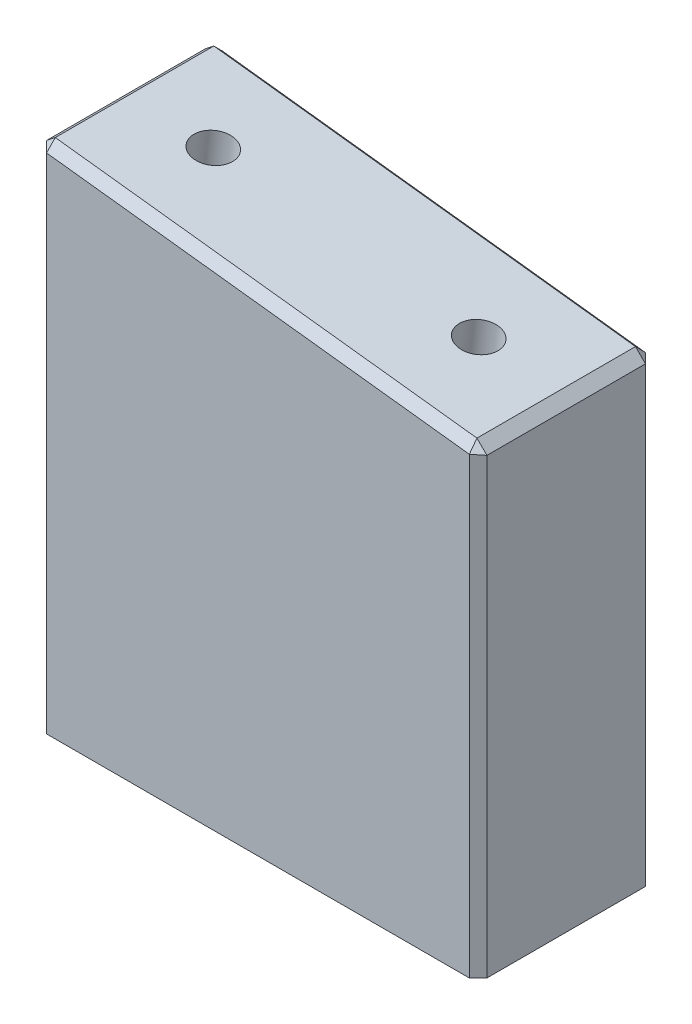
ISO-10303-21;
HEADER;
FILE_DESCRIPTION(('STEP AP214'),'2;1');
FILE_NAME('part.step','',(''),(''),'','','');
FILE_SCHEMA(('AUTOMOTIVE_DESIGN { 1 0 10303 214 1 1 1 1 }'));
ENDSEC;
DATA;
#1=APPLICATION_CONTEXT('core data for automotive mechanical design processes');
#2=APPLICATION_PROTOCOL_DEFINITION('international standard','automotive_design',2000,#1);
#3=PRODUCT_CONTEXT('',#1,'mechanical');
#4=PRODUCT('Part','Part','',(#3));
#5=PRODUCT_RELATED_PRODUCT_CATEGORY('part','',(#4));
#6=PRODUCT_DEFINITION_FORMATION('','',#4);
#7=PRODUCT_DEFINITION_CONTEXT('part definition',#1,'design');
#8=PRODUCT_DEFINITION('design','',#6,#7);
#9=PRODUCT_DEFINITION_SHAPE('','',#8);
#10=(LENGTH_UNIT() NAMED_UNIT(*) SI_UNIT(.MILLI.,.METRE.));
#11=(NAMED_UNIT(*) PLANE_ANGLE_UNIT() SI_UNIT($,.RADIAN.));
#12=(NAMED_UNIT(*) SI_UNIT($,.STERADIAN.) SOLID_ANGLE_UNIT());
#13=UNCERTAINTY_MEASURE_WITH_UNIT(LENGTH_MEASURE(1.E-05),#10,'distance_accuracy_value','');
#14=(GEOMETRIC_REPRESENTATION_CONTEXT(3) GLOBAL_UNCERTAINTY_ASSIGNED_CONTEXT((#13)) GLOBAL_UNIT_ASSIGNED_CONTEXT((#10,
#11,#12)) REPRESENTATION_CONTEXT('',''));
#15=CARTESIAN_POINT('',(0.,0.,0.));
#16=DIRECTION('',(0.,0.,1.));
#17=DIRECTION('',(1.,0.,0.));
#18=AXIS2_PLACEMENT_3D('',#15,#16,#17);
#19=CARTESIAN_POINT('',(2.10869816012002,41.8949020387802,3.));
#20=DIRECTION('',(-0.993190231504627,0.116503922868656,0.));
#21=DIRECTION('',(-0.116503922868656,-0.993190231504627,0.));
#22=AXIS2_PLACEMENT_3D('',#19,#20,#21);
#23=PLANE('',#22);
#24=DIRECTION('',(0.,0.,1.));
#25=VECTOR('',#24,1.);
#26=CARTESIAN_POINT('',(3.27373738880657,51.8268043538265,3.));
#27=LINE('',#26,#25);
#28=CARTESIAN_POINT('',(3.27373738880657,51.8268043538265,3.));
#29=VERTEX_POINT('',#28);
#30=CARTESIAN_POINT('',(3.27373738880658,51.8268043538265,17.));
#31=VERTEX_POINT('',#30);
#32=EDGE_CURVE('E186',#29,#31,#27,.T.);
#33=ORIENTED_EDGE('',*,*,#32,.T.);
#34=DIRECTION('',(0.116503922868656,0.993190231504627,0.));
#35=VECTOR('',#34,1.);
#36=CARTESIAN_POINT('',(2.10869816012002,41.8949020387802,17.));
#37=LINE('',#36,#35);
#38=CARTESIAN_POINT('',(2.10869816012002,41.8949020387802,17.));
#39=VERTEX_POINT('',#38);
#40=EDGE_CURVE('E163',#39,#31,#37,.T.);
#41=ORIENTED_EDGE('',*,*,#40,.F.);
#42=DIRECTION('',(0.,0.,1.));
#43=VECTOR('',#42,1.);
#44=CARTESIAN_POINT('',(2.10869816012002,41.8949020387802,3.));
#45=LINE('',#44,#43);
#46=CARTESIAN_POINT('',(2.10869816012002,41.8949020387802,3.));
#47=VERTEX_POINT('',#46);
#48=EDGE_CURVE('E174',#47,#39,#45,.T.);
#49=ORIENTED_EDGE('',*,*,#48,.F.);
#50=DIRECTION('',(0.116503922868656,0.993190231504627,0.));
#51=VECTOR('',#50,1.);
#52=CARTESIAN_POINT('',(2.10869816012002,41.8949020387802,3.));
#53=LINE('',#52,#51);
#54=EDGE_CURVE('E207',#47,#29,#53,.T.);
#55=ORIENTED_EDGE('',*,*,#54,.T.);
#56=EDGE_LOOP('',(#33,#41,#49,#55));
#57=FACE_BOUND('',#56,.T.);
#58=ADVANCED_FACE('F45',(#57),#23,.F.);
#59=CARTESIAN_POINT('',(2.10869816012002,41.8949020387802,3.));
#60=DIRECTION('',(0.,0.,-1.));
#61=DIRECTION('',(-1.,0.,0.));
#62=AXIS2_PLACEMENT_3D('',#59,#60,#61);
#63=PLANE('',#62);
#64=DIRECTION('',(-0.993190231504627,0.116503922868656,0.));
#65=VECTOR('',#64,1.);
#66=CARTESIAN_POINT('',(3.27373738880657,51.8268043538265,3.));
#67=LINE('',#66,#65);
#68=CARTESIAN_POINT('',(45.3282155367696,46.8936993725085,3.));
#69=VERTEX_POINT('',#68);
#70=EDGE_CURVE('E182',#69,#29,#67,.T.);
#71=ORIENTED_EDGE('',*,*,#70,.T.);
#72=ORIENTED_EDGE('',*,*,#54,.F.);
#73=DIRECTION('',(0.,-1.,0.));
#74=VECTOR('',#73,1.);
#75=CARTESIAN_POINT('',(2.10869816012002,41.8949020387802,3.));
#76=LINE('',#75,#74);
#77=CARTESIAN_POINT('',(2.10869816012002,0.,3.));
#78=VERTEX_POINT('',#77);
#79=EDGE_CURVE('E177',#47,#78,#76,.T.);
#80=ORIENTED_EDGE('',*,*,#79,.T.);
#81=DIRECTION('',(1.,0.,0.));
#82=VECTOR('',#81,1.);
#83=CARTESIAN_POINT('',(2.10869816012002,0.,3.));
#84=LINE('',#83,#82);
#85=CARTESIAN_POINT('',(44.163176308083,0.,3.));
#86=VERTEX_POINT('',#85);
#87=EDGE_CURVE('E341',#78,#86,#84,.T.);
#88=ORIENTED_EDGE('',*,*,#87,.T.);
#89=DIRECTION('',(0.,1.,0.));
#90=VECTOR('',#89,1.);
#91=CARTESIAN_POINT('',(44.163176308083,0.,3.));
#92=LINE('',#91,#90);
#93=CARTESIAN_POINT('',(44.163176308083,36.9617970574622,3.));
#94=VERTEX_POINT('',#93);
#95=EDGE_CURVE('E171',#86,#94,#92,.T.);
#96=ORIENTED_EDGE('',*,*,#95,.T.);
#97=DIRECTION('',(0.116503922868656,0.993190231504627,0.));
#98=VECTOR('',#97,1.);
#99=CARTESIAN_POINT('',(44.163176308083,36.9617970574622,3.));
#100=LINE('',#99,#98);
#101=EDGE_CURVE('E193',#94,#69,#100,.T.);
#102=ORIENTED_EDGE('',*,*,#101,.T.);
#103=EDGE_LOOP('',(#71,#72,#80,#88,#96,#102));
#104=FACE_BOUND('',#103,.T.);
#105=ADVANCED_FACE('F367',(#104),#63,.F.);
#106=CARTESIAN_POINT('',(44.163176308083,36.9617970574622,3.));
#107=DIRECTION('',(0.993190231504627,-0.116503922868656,0.));
#108=DIRECTION('',(0.116503922868656,0.993190231504627,0.));
#109=AXIS2_PLACEMENT_3D('',#106,#107,#108);
#110=PLANE('',#109);
#111=DIRECTION('',(0.,0.,-1.));
#112=VECTOR('',#111,1.);
#113=CARTESIAN_POINT('',(45.3282155367696,46.8936993725085,3.));
#114=LINE('',#113,#112);
#115=CARTESIAN_POINT('',(45.3282155367696,46.8936993725085,17.));
#116=VERTEX_POINT('',#115);
#117=EDGE_CURVE('E356',#116,#69,#114,.T.);
#118=ORIENTED_EDGE('',*,*,#117,.T.);
#119=ORIENTED_EDGE('',*,*,#101,.F.);
#120=DIRECTION('',(0.,0.,-1.));
#121=VECTOR('',#120,1.);
#122=CARTESIAN_POINT('',(44.163176308083,36.9617970574622,3.));
#123=LINE('',#122,#121);
#124=CARTESIAN_POINT('',(44.163176308083,36.9617970574622,17.));
#125=VERTEX_POINT('',#124);
#126=EDGE_CURVE('E181',#125,#94,#123,.T.);
#127=ORIENTED_EDGE('',*,*,#126,.F.);
#128=DIRECTION('',(0.116503922868656,0.993190231504627,0.));
#129=VECTOR('',#128,1.);
#130=CARTESIAN_POINT('',(44.163176308083,36.9617970574622,17.));
#131=LINE('',#130,#129);
#132=EDGE_CURVE('E188',#125,#116,#131,.T.);
#133=ORIENTED_EDGE('',*,*,#132,.T.);
#134=EDGE_LOOP('',(#118,#119,#127,#133));
#135=FACE_BOUND('',#134,.T.);
#136=ADVANCED_FACE('F373',(#135),#110,.F.);
#137=CARTESIAN_POINT('',(2.10869816012002,41.8949020387802,17.));
#138=DIRECTION('',(0.,0.,1.));
#139=DIRECTION('',(1.,0.,0.));
#140=AXIS2_PLACEMENT_3D('',#137,#138,#139);
#141=PLANE('',#140);
#142=DIRECTION('',(0.993190231504627,-0.116503922868656,0.));
#143=VECTOR('',#142,1.);
#144=CARTESIAN_POINT('',(3.27373738880658,51.8268043538265,17.));
#145=LINE('',#144,#143);
#146=EDGE_CURVE('E353',#31,#116,#145,.T.);
#147=ORIENTED_EDGE('',*,*,#146,.T.);
#148=ORIENTED_EDGE('',*,*,#132,.F.);
#149=DIRECTION('',(0.,1.,0.));
#150=VECTOR('',#149,1.);
#151=CARTESIAN_POINT('',(44.163176308083,0.,17.));
#152=LINE('',#151,#150);
#153=CARTESIAN_POINT('',(44.163176308083,0.,17.));
#154=VERTEX_POINT('',#153);
#155=EDGE_CURVE('E335',#154,#125,#152,.T.);
#156=ORIENTED_EDGE('',*,*,#155,.F.);
#157=DIRECTION('',(1.,0.,0.));
#158=VECTOR('',#157,1.);
#159=CARTESIAN_POINT('',(2.10869816012002,0.,17.));
#160=LINE('',#159,#158);
#161=CARTESIAN_POINT('',(2.10869816012002,0.,17.));
#162=VERTEX_POINT('',#161);
#163=EDGE_CURVE('E167',#162,#154,#160,.T.);
#164=ORIENTED_EDGE('',*,*,#163,.F.);
#165=DIRECTION('',(0.,-1.,0.));
#166=VECTOR('',#165,1.);
#167=CARTESIAN_POINT('',(2.10869816012002,41.8949020387802,17.));
#168=LINE('',#167,#166);
#169=EDGE_CURVE('E158',#39,#162,#168,.T.);
#170=ORIENTED_EDGE('',*,*,#169,.F.);
#171=ORIENTED_EDGE('',*,*,#40,.T.);
#172=EDGE_LOOP('',(#147,#148,#156,#164,#170,#171));
#173=FACE_BOUND('',#172,.T.);
#174=ADVANCED_FACE('F161',(#173),#141,.F.);
#175=CARTESIAN_POINT('',(6.04134343223708,51.5021566168807,0.));
#176=DIRECTION('',(0.116503922868656,0.993190231504627,0.));
#177=DIRECTION('',(-0.993190231504627,0.116503922868656,0.));
#178=AXIS2_PLACEMENT_3D('',#175,#176,#177);
#179=PLANE('',#178);
#180=CARTESIAN_POINT('',(9.23287877783434,51.1277808166146,10.));
#181=DIRECTION('',(0.116503922868656,0.993190231504627,0.));
#182=DIRECTION('',(-0.993190231504627,0.116503922868656,0.));
#183=AXIS2_PLACEMENT_3D('',#180,#181,#182);
#184=CIRCLE('',#183,2.2);
#185=CARTESIAN_POINT('',(7.04786026852416,51.3840894469256,10.));
#186=VERTEX_POINT('',#185);
#187=EDGE_CURVE('E330',#186,#186,#184,.F.);
#188=ORIENTED_EDGE('',*,*,#187,.F.);
#189=EDGE_LOOP('',(#188));
#190=FACE_BOUND('',#189,.T.);
#191=CARTESIAN_POINT('',(39.3690741477418,47.5927229097204,10.));
#192=DIRECTION('',(0.116503922868656,0.993190231504627,0.));
#193=DIRECTION('',(-0.993190231504627,0.116503922868656,0.));
#194=AXIS2_PLACEMENT_3D('',#191,#192,#193);
#195=CIRCLE('',#194,2.20000000000001);
#196=CARTESIAN_POINT('',(37.1840556384316,47.8490315400315,10.));
#197=VERTEX_POINT('',#196);
#198=EDGE_CURVE('E316',#197,#197,#195,.F.);
#199=ORIENTED_EDGE('',*,*,#198,.F.);
#200=EDGE_LOOP('',(#199));
#201=FACE_BOUND('',#200,.T.);
#202=ORIENTED_EDGE('',*,*,#32,.F.);
#203=ORIENTED_EDGE('',*,*,#70,.F.);
#204=ORIENTED_EDGE('',*,*,#117,.F.);
#205=ORIENTED_EDGE('',*,*,#146,.F.);
#206=EDGE_LOOP('',(#202,#203,#204,#205));
#207=FACE_BOUND('',#206,.T.);
#208=ADVANCED_FACE('F376',(#190,#201,#207),#179,.F.);
#209=CARTESIAN_POINT('',(2.10869816012002,41.8949020387802,17.));
#210=DIRECTION('',(1.,0.,0.));
#211=DIRECTION('',(0.,0.,-1.));
#212=AXIS2_PLACEMENT_3D('',#209,#210,#211);
#213=PLANE('',#212);
#214=ORIENTED_EDGE('',*,*,#79,.F.);
#215=ORIENTED_EDGE('',*,*,#48,.T.);
#216=ORIENTED_EDGE('',*,*,#169,.T.);
#217=DIRECTION('',(0.,0.,-1.));
#218=VECTOR('',#217,1.);
#219=CARTESIAN_POINT('',(2.10869816012002,0.,17.));
#220=LINE('',#219,#218);
#221=EDGE_CURVE('E349',#162,#78,#220,.T.);
#222=ORIENTED_EDGE('',*,*,#221,.T.);
#223=EDGE_LOOP('',(#214,#215,#216,#222));
#224=FACE_BOUND('',#223,.T.);
#225=ADVANCED_FACE('F175',(#224),#213,.T.);
#226=CARTESIAN_POINT('',(44.163176308083,0.,17.));
#227=DIRECTION('',(-1.,0.,0.));
#228=DIRECTION('',(0.,0.,1.));
#229=AXIS2_PLACEMENT_3D('',#226,#227,#228);
#230=PLANE('',#229);
#231=ORIENTED_EDGE('',*,*,#95,.F.);
#232=DIRECTION('',(0.,0.,-1.));
#233=VECTOR('',#232,1.);
#234=CARTESIAN_POINT('',(44.163176308083,0.,17.));
#235=LINE('',#234,#233);
#236=EDGE_CURVE('E338',#154,#86,#235,.T.);
#237=ORIENTED_EDGE('',*,*,#236,.F.);
#238=ORIENTED_EDGE('',*,*,#155,.T.);
#239=ORIENTED_EDGE('',*,*,#126,.T.);
#240=EDGE_LOOP('',(#231,#237,#238,#239));
#241=FACE_BOUND('',#240,.T.);
#242=ADVANCED_FACE('F378',(#241),#230,.T.);
#243=CARTESIAN_POINT('',(0.,0.,20.));
#244=DIRECTION('',(0.,1.,0.));
#245=DIRECTION('',(0.,0.,1.));
#246=AXIS2_PLACEMENT_3D('',#243,#244,#245);
#247=PLANE('',#246);
#248=ORIENTED_EDGE('',*,*,#221,.F.);
#249=ORIENTED_EDGE('',*,*,#163,.T.);
#250=ORIENTED_EDGE('',*,*,#236,.T.);
#251=ORIENTED_EDGE('',*,*,#87,.F.);
#252=EDGE_LOOP('',(#248,#249,#250,#251));
#253=FACE_BOUND('',#252,.T.);
#254=DIRECTION('',(1.,0.,0.));
#255=VECTOR('',#254,1.);
#256=CARTESIAN_POINT('',(0.,0.,0.));
#257=LINE('',#256,#255);
#258=CARTESIAN_POINT('',(1.00000000000001,0.,0.));
#259=VERTEX_POINT('',#258);
#260=CARTESIAN_POINT('',(49.,0.,0.));
#261=VERTEX_POINT('',#260);
#262=EDGE_CURVE('E203',#259,#261,#257,.T.);
#263=ORIENTED_EDGE('',*,*,#262,.T.);
#264=DIRECTION('',(-0.707106781186548,0.,-0.707106781186548));
#265=VECTOR('',#264,1.);
#266=CARTESIAN_POINT('',(50.,0.,1.00000000000001));
#267=LINE('',#266,#265);
#268=CARTESIAN_POINT('',(50.,0.,1.00000000000001));
#269=VERTEX_POINT('',#268);
#270=EDGE_CURVE('E256',#261,#269,#267,.F.);
#271=ORIENTED_EDGE('',*,*,#270,.T.);
#272=DIRECTION('',(0.,0.,-1.));
#273=VECTOR('',#272,1.);
#274=CARTESIAN_POINT('',(50.,0.,20.));
#275=LINE('',#274,#273);
#276=CARTESIAN_POINT('',(50.,0.,19.));
#277=VERTEX_POINT('',#276);
#278=EDGE_CURVE('E211',#277,#269,#275,.T.);
#279=ORIENTED_EDGE('',*,*,#278,.F.);
#280=DIRECTION('',(-0.707106781186548,0.,0.707106781186548));
#281=VECTOR('',#280,1.);
#282=CARTESIAN_POINT('',(49.,0.,20.));
#283=LINE('',#282,#281);
#284=CARTESIAN_POINT('',(49.,0.,20.));
#285=VERTEX_POINT('',#284);
#286=EDGE_CURVE('E247',#277,#285,#283,.T.);
#287=ORIENTED_EDGE('',*,*,#286,.T.);
#288=DIRECTION('',(1.,0.,0.));
#289=VECTOR('',#288,1.);
#290=CARTESIAN_POINT('',(0.,0.,20.));
#291=LINE('',#290,#289);
#292=CARTESIAN_POINT('',(1.00000000000001,0.,20.));
#293=VERTEX_POINT('',#292);
#294=EDGE_CURVE('E199',#293,#285,#291,.T.);
#295=ORIENTED_EDGE('',*,*,#294,.F.);
#296=DIRECTION('',(-0.707106781186547,0.,-0.707106781186548));
#297=VECTOR('',#296,1.);
#298=CARTESIAN_POINT('',(1.00000000000001,0.,20.));
#299=LINE('',#298,#297);
#300=CARTESIAN_POINT('',(0.,0.,19.));
#301=VERTEX_POINT('',#300);
#302=EDGE_CURVE('E250',#293,#301,#299,.T.);
#303=ORIENTED_EDGE('',*,*,#302,.T.);
#304=DIRECTION('',(0.,0.,-1.));
#305=VECTOR('',#304,1.);
#306=CARTESIAN_POINT('',(0.,0.,20.));
#307=LINE('',#306,#305);
#308=CARTESIAN_POINT('',(0.,0.,1.00000000000001));
#309=VERTEX_POINT('',#308);
#310=EDGE_CURVE('E202',#301,#309,#307,.T.);
#311=ORIENTED_EDGE('',*,*,#310,.T.);
#312=DIRECTION('',(-0.707106781186547,0.,0.707106781186548));
#313=VECTOR('',#312,1.);
#314=CARTESIAN_POINT('',(0.,0.,1.00000000000001));
#315=LINE('',#314,#313);
#316=EDGE_CURVE('E253',#309,#259,#315,.F.);
#317=ORIENTED_EDGE('',*,*,#316,.T.);
#318=EDGE_LOOP('',(#263,#271,#279,#287,#295,#303,#311,#317));
#319=FACE_BOUND('',#318,.T.);
#320=ADVANCED_FACE('F381',(#253,#319),#247,.F.);
#321=CARTESIAN_POINT('',(50.,0.,20.));
#322=DIRECTION('',(-1.,0.,0.));
#323=DIRECTION('',(0.,0.,1.));
#324=AXIS2_PLACEMENT_3D('',#321,#322,#323);
#325=PLANE('',#324);
#326=ORIENTED_EDGE('',*,*,#278,.T.);
#327=DIRECTION('',(0.,1.,0.));
#328=VECTOR('',#327,1.);
#329=CARTESIAN_POINT('',(50.,0.,1.00000000000001));
#330=LINE('',#329,#328);
#331=CARTESIAN_POINT('',(50.,51.3868250700616,1.00000000000001));
#332=VERTEX_POINT('',#331);
#333=EDGE_CURVE('E235',#269,#332,#330,.T.);
#334=ORIENTED_EDGE('',*,*,#333,.T.);
#335=DIRECTION('',(0.,0.,1.));
#336=VECTOR('',#335,1.);
#337=CARTESIAN_POINT('',(50.,51.3868250700616,20.));
#338=LINE('',#337,#336);
#339=CARTESIAN_POINT('',(50.,51.3868250700616,19.));
#340=VERTEX_POINT('',#339);
#341=EDGE_CURVE('E231',#332,#340,#338,.T.);
#342=ORIENTED_EDGE('',*,*,#341,.T.);
#343=DIRECTION('',(0.,-1.,0.));
#344=VECTOR('',#343,1.);
#345=CARTESIAN_POINT('',(50.,0.,19.));
#346=LINE('',#345,#344);
#347=EDGE_CURVE('E228',#340,#277,#346,.T.);
#348=ORIENTED_EDGE('',*,*,#347,.T.);
#349=EDGE_LOOP('',(#326,#334,#342,#348));
#350=FACE_BOUND('',#349,.T.);
#351=ADVANCED_FACE('F384',(#350),#325,.F.);
#352=CARTESIAN_POINT('',(50.,52.3868250700616,20.));
#353=DIRECTION('',(-0.116503922868656,-0.993190231504627,0.));
#354=DIRECTION('',(0.993190231504627,-0.116503922868656,0.));
#355=AXIS2_PLACEMENT_3D('',#352,#353,#354);
#356=PLANE('',#355);
#357=DIRECTION('',(0.993190231504627,-0.116503922868656,0.));
#358=VECTOR('',#357,1.);
#359=CARTESIAN_POINT('',(50.,52.3868250700616,19.));
#360=LINE('',#359,#358);
#361=CARTESIAN_POINT('',(0.993190231504618,58.1354575114602,19.));
#362=VERTEX_POINT('',#361);
#363=CARTESIAN_POINT('',(48.8671087688709,52.5197163011907,19.));
#364=VERTEX_POINT('',#363);
#365=EDGE_CURVE('E215',#362,#364,#360,.T.);
#366=ORIENTED_EDGE('',*,*,#365,.T.);
#367=DIRECTION('',(0.,0.,-1.));
#368=VECTOR('',#367,1.);
#369=CARTESIAN_POINT('',(48.8671087688709,52.5197163011907,20.));
#370=LINE('',#369,#368);
#371=CARTESIAN_POINT('',(48.8671087688709,52.5197163011907,1.00000000000001));
#372=VERTEX_POINT('',#371);
#373=EDGE_CURVE('E224',#364,#372,#370,.T.);
#374=ORIENTED_EDGE('',*,*,#373,.T.);
#375=DIRECTION('',(-0.993190231504627,0.116503922868656,0.));
#376=VECTOR('',#375,1.);
#377=CARTESIAN_POINT('',(50.,52.3868250700616,1.00000000000001));
#378=LINE('',#377,#376);
#379=CARTESIAN_POINT('',(0.993190231504618,58.1354575114602,1.00000000000001));
#380=VERTEX_POINT('',#379);
#381=EDGE_CURVE('E221',#372,#380,#378,.T.);
#382=ORIENTED_EDGE('',*,*,#381,.T.);
#383=DIRECTION('',(0.,0.,1.));
#384=VECTOR('',#383,1.);
#385=CARTESIAN_POINT('',(0.993190231504612,58.1354575114602,20.));
#386=LINE('',#385,#384);
#387=EDGE_CURVE('E218',#380,#362,#386,.T.);
#388=ORIENTED_EDGE('',*,*,#387,.T.);
#389=EDGE_LOOP('',(#366,#374,#382,#388));
#390=FACE_BOUND('',#389,.T.);
#391=CARTESIAN_POINT('',(9.93190231504627,57.0869222056423,10.));
#392=DIRECTION('',(0.116503922868656,0.993190231504627,0.));
#393=DIRECTION('',(-0.993190231504627,0.116503922868656,0.));
#394=AXIS2_PLACEMENT_3D('',#391,#392,#393);
#395=CIRCLE('',#394,2.2);
#396=CARTESIAN_POINT('',(7.7468838057361,57.3432308359534,10.));
#397=VERTEX_POINT('',#396);
#398=EDGE_CURVE('E327',#397,#397,#395,.T.);
#399=ORIENTED_EDGE('',*,*,#398,.F.);
#400=EDGE_LOOP('',(#399));
#401=FACE_BOUND('',#400,.T.);
#402=CARTESIAN_POINT('',(40.0680976849537,53.5518642987482,10.));
#403=DIRECTION('',(0.116503922868656,0.993190231504627,0.));
#404=DIRECTION('',(-0.993190231504627,0.116503922868656,0.));
#405=AXIS2_PLACEMENT_3D('',#402,#403,#404);
#406=CIRCLE('',#405,2.20000000000001);
#407=CARTESIAN_POINT('',(37.8830791756435,53.8081729290592,10.));
#408=VERTEX_POINT('',#407);
#409=EDGE_CURVE('E320',#408,#408,#406,.T.);
#410=ORIENTED_EDGE('',*,*,#409,.F.);
#411=EDGE_LOOP('',(#410));
#412=FACE_BOUND('',#411,.T.);
#413=ADVANCED_FACE('F446',(#390,#401,#412),#356,.F.);
#414=CARTESIAN_POINT('',(0.,58.2519614343288,20.));
#415=DIRECTION('',(1.,0.,0.));
#416=DIRECTION('',(0.,0.,-1.));
#417=AXIS2_PLACEMENT_3D('',#414,#415,#416);
#418=PLANE('',#417);
#419=DIRECTION('',(0.,0.,-1.));
#420=VECTOR('',#419,1.);
#421=CARTESIAN_POINT('',(0.,57.3508122338405,20.));
#422=LINE('',#421,#420);
#423=CARTESIAN_POINT('',(0.,57.3508122338405,19.));
#424=VERTEX_POINT('',#423);
#425=CARTESIAN_POINT('',(0.,57.3508122338405,1.00000000000001));
#426=VERTEX_POINT('',#425);
#427=EDGE_CURVE('E262',#424,#426,#422,.T.);
#428=ORIENTED_EDGE('',*,*,#427,.T.);
#429=DIRECTION('',(0.,-1.,0.));
#430=VECTOR('',#429,1.);
#431=CARTESIAN_POINT('',(0.,58.2519614343288,1.00000000000001));
#432=LINE('',#431,#430);
#433=EDGE_CURVE('E265',#426,#309,#432,.T.);
#434=ORIENTED_EDGE('',*,*,#433,.T.);
#435=ORIENTED_EDGE('',*,*,#310,.F.);
#436=DIRECTION('',(0.,1.,0.));
#437=VECTOR('',#436,1.);
#438=CARTESIAN_POINT('',(0.,58.2519614343288,19.));
#439=LINE('',#438,#437);
#440=EDGE_CURVE('E259',#301,#424,#439,.T.);
#441=ORIENTED_EDGE('',*,*,#440,.T.);
#442=EDGE_LOOP('',(#428,#434,#435,#441));
#443=FACE_BOUND('',#442,.T.);
#444=ADVANCED_FACE('F440',(#443),#418,.F.);
#445=CARTESIAN_POINT('',(0.,0.,20.));
#446=DIRECTION('',(0.,0.,1.));
#447=DIRECTION('',(1.,0.,0.));
#448=AXIS2_PLACEMENT_3D('',#445,#446,#447);
#449=PLANE('',#448);
#450=DIRECTION('',(-0.993190231504627,0.116503922868656,0.));
#451=VECTOR('',#450,1.);
#452=CARTESIAN_POINT('',(-0.116503922868655,57.2587712028242,20.));
#453=LINE('',#452,#451);
#454=CARTESIAN_POINT('',(49.,51.4972713379504,20.));
#455=VERTEX_POINT('',#454);
#456=CARTESIAN_POINT('',(1.00000000000001,57.1278022476469,20.));
#457=VERTEX_POINT('',#456);
#458=EDGE_CURVE('E63',#455,#457,#453,.T.);
#459=ORIENTED_EDGE('',*,*,#458,.T.);
#460=DIRECTION('',(0.,-1.,0.));
#461=VECTOR('',#460,1.);
#462=CARTESIAN_POINT('',(1.00000000000001,0.,20.));
#463=LINE('',#462,#461);
#464=EDGE_CURVE('E11',#457,#293,#463,.T.);
#465=ORIENTED_EDGE('',*,*,#464,.T.);
#466=ORIENTED_EDGE('',*,*,#294,.T.);
#467=DIRECTION('',(0.,1.,0.));
#468=VECTOR('',#467,1.);
#469=CARTESIAN_POINT('',(49.,52.3868250700616,20.));
#470=LINE('',#469,#468);
#471=EDGE_CURVE('E56',#285,#455,#470,.T.);
#472=ORIENTED_EDGE('',*,*,#471,.T.);
#473=EDGE_LOOP('',(#459,#465,#466,#472));
#474=FACE_BOUND('',#473,.T.);
#475=ADVANCED_FACE('F436',(#474),#449,.T.);
#476=CARTESIAN_POINT('',(0.,0.,0.));
#477=DIRECTION('',(0.,0.,1.));
#478=DIRECTION('',(1.,0.,0.));
#479=AXIS2_PLACEMENT_3D('',#476,#477,#478);
#480=PLANE('',#479);
#481=DIRECTION('',(0.993190231504627,-0.116503922868656,0.));
#482=VECTOR('',#481,1.);
#483=CARTESIAN_POINT('',(6.62386304658035,56.4681077744038,0.));
#484=LINE('',#483,#482);
#485=CARTESIAN_POINT('',(1.00000000000001,57.1278022476469,0.));
#486=VERTEX_POINT('',#485);
#487=CARTESIAN_POINT('',(49.,51.4972713379504,0.));
#488=VERTEX_POINT('',#487);
#489=EDGE_CURVE('E238',#486,#488,#484,.T.);
#490=ORIENTED_EDGE('',*,*,#489,.T.);
#491=DIRECTION('',(0.,-1.,0.));
#492=VECTOR('',#491,1.);
#493=CARTESIAN_POINT('',(49.,0.,0.));
#494=LINE('',#493,#492);
#495=EDGE_CURVE('E244',#488,#261,#494,.T.);
#496=ORIENTED_EDGE('',*,*,#495,.T.);
#497=ORIENTED_EDGE('',*,*,#262,.F.);
#498=DIRECTION('',(0.,1.,0.));
#499=VECTOR('',#498,1.);
#500=CARTESIAN_POINT('',(1.00000000000001,0.,0.));
#501=LINE('',#500,#499);
#502=EDGE_CURVE('E241',#259,#486,#501,.T.);
#503=ORIENTED_EDGE('',*,*,#502,.T.);
#504=EDGE_LOOP('',(#490,#496,#497,#503));
#505=FACE_BOUND('',#504,.T.);
#506=ADVANCED_FACE('F439',(#505),#480,.F.);
#507=CARTESIAN_POINT('',(38.6441238654635,41.412557289915,10.));
#508=DIRECTION('',(0.116503922868656,0.993190231504627,0.));
#509=DIRECTION('',(-0.993190231504627,0.116503922868656,0.));
#510=AXIS2_PLACEMENT_3D('',#507,#508,#509);
#511=CYLINDRICAL_SURFACE('',#510,2.20000000000001);
#512=ORIENTED_EDGE('',*,*,#198,.T.);
#513=EDGE_LOOP('',(#512));
#514=FACE_BOUND('',#513,.T.);
#515=ORIENTED_EDGE('',*,*,#409,.T.);
#516=EDGE_LOOP('',(#515));
#517=FACE_BOUND('',#516,.T.);
#518=ADVANCED_FACE('F443',(#514,#517),#511,.F.);
#519=CARTESIAN_POINT('',(8.50792849555604,44.9476151968091,10.));
#520=DIRECTION('',(0.116503922868656,0.993190231504627,0.));
#521=DIRECTION('',(-0.993190231504627,0.116503922868656,0.));
#522=AXIS2_PLACEMENT_3D('',#519,#520,#521);
#523=CYLINDRICAL_SURFACE('',#522,2.2);
#524=ORIENTED_EDGE('',*,*,#187,.T.);
#525=EDGE_LOOP('',(#524));
#526=FACE_BOUND('',#525,.T.);
#527=ORIENTED_EDGE('',*,*,#398,.T.);
#528=EDGE_LOOP('',(#527));
#529=FACE_BOUND('',#528,.T.);
#530=ADVANCED_FACE('F506',(#526,#529),#523,.F.);
#531=CARTESIAN_POINT('',(1.00000000000001,0.,20.));
#532=DIRECTION('',(-0.707106781186548,0.,0.707106781186547));
#533=DIRECTION('',(0.,1.,0.));
#534=AXIS2_PLACEMENT_3D('',#531,#532,#533);
#535=PLANE('',#534);
#536=ORIENTED_EDGE('',*,*,#302,.F.);
#537=ORIENTED_EDGE('',*,*,#464,.F.);
#538=DIRECTION('',(0.698475706013027,-0.155767057554555,0.698475706013029));
#539=VECTOR('',#538,1.);
#540=CARTESIAN_POINT('',(0.399177023433059,57.2617917713559,19.3991770234331));
#541=LINE('',#540,#539);
#542=EDGE_CURVE('E50',#424,#457,#541,.T.);
#543=ORIENTED_EDGE('',*,*,#542,.F.);
#544=ORIENTED_EDGE('',*,*,#440,.F.);
#545=EDGE_LOOP('',(#536,#537,#543,#544));
#546=FACE_BOUND('',#545,.T.);
#547=ADVANCED_FACE('F48',(#546),#535,.T.);
#548=CARTESIAN_POINT('',(0.,57.3508122338405,20.));
#549=DIRECTION('',(0.619910833809897,-0.78467226160042,0.));
#550=DIRECTION('',(0.,0.,-1.));
#551=AXIS2_PLACEMENT_3D('',#548,#549,#550);
#552=PLANE('',#551);
#553=DIRECTION('',(-0.78467226160042,-0.619910833809897,0.));
#554=VECTOR('',#553,1.);
#555=CARTESIAN_POINT('',(0.507232516154314,57.7515386866699,1.00000000000001));
#556=LINE('',#555,#554);
#557=EDGE_CURVE('E305',#426,#380,#556,.F.);
#558=ORIENTED_EDGE('',*,*,#557,.F.);
#559=ORIENTED_EDGE('',*,*,#427,.F.);
#560=DIRECTION('',(0.78467226160042,0.619910833809897,0.));
#561=VECTOR('',#560,1.);
#562=CARTESIAN_POINT('',(0.993190231504618,58.1354575114602,19.));
#563=LINE('',#562,#561);
#564=EDGE_CURVE('E308',#362,#424,#563,.F.);
#565=ORIENTED_EDGE('',*,*,#564,.F.);
#566=ORIENTED_EDGE('',*,*,#387,.F.);
#567=EDGE_LOOP('',(#558,#559,#565,#566));
#568=FACE_BOUND('',#567,.T.);
#569=ADVANCED_FACE('F424',(#568),#552,.F.);
#570=CARTESIAN_POINT('',(0.,58.2519614343288,1.00000000000001));
#571=DIRECTION('',(0.707106781186548,0.,0.707106781186547));
#572=DIRECTION('',(0.,-1.,0.));
#573=AXIS2_PLACEMENT_3D('',#570,#571,#572);
#574=PLANE('',#573);
#575=ORIENTED_EDGE('',*,*,#316,.F.);
#576=ORIENTED_EDGE('',*,*,#433,.F.);
#577=DIRECTION('',(0.698475706013027,-0.155767057554559,-0.698475706013028));
#578=VECTOR('',#577,1.);
#579=CARTESIAN_POINT('',(1.00000000000001,57.1278022476469,0.));
#580=LINE('',#579,#578);
#581=EDGE_CURVE('E301',#486,#426,#580,.F.);
#582=ORIENTED_EDGE('',*,*,#581,.F.);
#583=ORIENTED_EDGE('',*,*,#502,.F.);
#584=EDGE_LOOP('',(#575,#576,#582,#583));
#585=FACE_BOUND('',#584,.T.);
#586=ADVANCED_FACE('F417',(#585),#574,.F.);
#587=CARTESIAN_POINT('',(0.993190231504618,58.1354575114602,19.));
#588=DIRECTION('',(-0.485273811313314,0.614251079753583,0.622257936128585));
#589=DIRECTION('',(0.,-0.711670640755448,0.702513273245944));
#590=AXIS2_PLACEMENT_3D('',#587,#588,#589);
#591=PLANE('',#590);
#592=ORIENTED_EDGE('',*,*,#564,.T.);
#593=ORIENTED_EDGE('',*,*,#542,.T.);
#594=DIRECTION('',(-0.00479678276102369,0.709789679602928,-0.704397332195627));
#595=VECTOR('',#594,1.);
#596=CARTESIAN_POINT('',(0.993190231504616,58.1354575114602,19.));
#597=LINE('',#596,#595);
#598=EDGE_CURVE('E298',#362,#457,#597,.F.);
#599=ORIENTED_EDGE('',*,*,#598,.F.);
#600=EDGE_LOOP('',(#592,#593,#599));
#601=FACE_BOUND('',#600,.T.);
#602=ADVANCED_FACE('F414',(#601),#591,.T.);
#603=CARTESIAN_POINT('',(1.00000000000001,57.1278022476469,0.));
#604=DIRECTION('',(-0.485273811313313,0.614251079753582,-0.622257936128588));
#605=DIRECTION('',(0.,0.71167064075545,0.702513273245942));
#606=AXIS2_PLACEMENT_3D('',#603,#604,#605);
#607=PLANE('',#606);
#608=ORIENTED_EDGE('',*,*,#581,.T.);
#609=ORIENTED_EDGE('',*,*,#557,.T.);
#610=DIRECTION('',(-0.00479678276102819,0.709789679602928,0.704397332195627));
#611=VECTOR('',#610,1.);
#612=CARTESIAN_POINT('',(1.00000000000001,57.1278022476469,0.));
#613=LINE('',#612,#611);
#614=EDGE_CURVE('E294',#486,#380,#613,.T.);
#615=ORIENTED_EDGE('',*,*,#614,.F.);
#616=EDGE_LOOP('',(#608,#609,#615));
#617=FACE_BOUND('',#616,.T.);
#618=ADVANCED_FACE('F416',(#617),#607,.T.);
#619=CARTESIAN_POINT('',(49.,0.,20.));
#620=DIRECTION('',(0.707106781186547,0.,0.707106781186547));
#621=DIRECTION('',(0.,-1.,0.));
#622=AXIS2_PLACEMENT_3D('',#619,#620,#621);
#623=PLANE('',#622);
#624=ORIENTED_EDGE('',*,*,#286,.F.);
#625=ORIENTED_EDGE('',*,*,#347,.F.);
#626=DIRECTION('',(0.70496020651761,-0.0778602238199833,-0.70496020651761));
#627=VECTOR('',#626,1.);
#628=CARTESIAN_POINT('',(50.,51.3868250700616,19.));
#629=LINE('',#628,#627);
#630=EDGE_CURVE('E290',#455,#340,#629,.T.);
#631=ORIENTED_EDGE('',*,*,#630,.F.);
#632=ORIENTED_EDGE('',*,*,#471,.F.);
#633=EDGE_LOOP('',(#624,#625,#631,#632));
#634=FACE_BOUND('',#633,.T.);
#635=ADVANCED_FACE('F404',(#634),#623,.T.);
#636=CARTESIAN_POINT('',(6.62386304658035,56.4681077744038,20.));
#637=DIRECTION('',(0.0823807138952615,0.702291547705163,0.707106781186543));
#638=DIRECTION('',(0.993190231504627,-0.116503922868656,0.));
#639=AXIS2_PLACEMENT_3D('',#636,#637,#638);
#640=PLANE('',#639);
#641=ORIENTED_EDGE('',*,*,#598,.T.);
#642=ORIENTED_EDGE('',*,*,#458,.F.);
#643=DIRECTION('',(0.0925211558959859,-0.711843731413192,0.696217162787168));
#644=VECTOR('',#643,1.);
#645=CARTESIAN_POINT('',(48.951419405639,51.8710430578272,19.634433408824));
#646=LINE('',#645,#644);
#647=EDGE_CURVE('E286',#364,#455,#646,.T.);
#648=ORIENTED_EDGE('',*,*,#647,.F.);
#649=ORIENTED_EDGE('',*,*,#365,.F.);
#650=EDGE_LOOP('',(#641,#642,#648,#649));
#651=FACE_BOUND('',#650,.T.);
#652=ADVANCED_FACE('F413',(#651),#640,.T.);
#653=CARTESIAN_POINT('',(50.,52.3868250700616,1.00000000000001));
#654=DIRECTION('',(-0.0823807138952615,-0.702291547705163,0.707106781186544));
#655=DIRECTION('',(-0.993190231504627,0.116503922868656,0.));
#656=AXIS2_PLACEMENT_3D('',#653,#654,#655);
#657=PLANE('',#656);
#658=ORIENTED_EDGE('',*,*,#614,.T.);
#659=ORIENTED_EDGE('',*,*,#381,.F.);
#660=DIRECTION('',(0.0925211558959799,-0.711843731413192,-0.696217162787169));
#661=VECTOR('',#660,1.);
#662=CARTESIAN_POINT('',(48.8671087688709,52.5197163011907,1.00000000000002));
#663=LINE('',#662,#661);
#664=EDGE_CURVE('E282',#488,#372,#663,.F.);
#665=ORIENTED_EDGE('',*,*,#664,.F.);
#666=ORIENTED_EDGE('',*,*,#489,.F.);
#667=EDGE_LOOP('',(#658,#659,#665,#666));
#668=FACE_BOUND('',#667,.T.);
#669=ADVANCED_FACE('F476',(#668),#657,.F.);
#670=CARTESIAN_POINT('',(50.,0.,1.00000000000001));
#671=DIRECTION('',(-0.707106781186547,0.,0.707106781186547));
#672=DIRECTION('',(0.,1.,0.));
#673=AXIS2_PLACEMENT_3D('',#670,#671,#672);
#674=PLANE('',#673);
#675=ORIENTED_EDGE('',*,*,#270,.F.);
#676=ORIENTED_EDGE('',*,*,#495,.F.);
#677=DIRECTION('',(0.70496020651761,-0.0778602238199778,0.70496020651761));
#678=VECTOR('',#677,1.);
#679=CARTESIAN_POINT('',(49.3748057581057,51.4558754407843,0.374805758105729));
#680=LINE('',#679,#678);
#681=EDGE_CURVE('E278',#332,#488,#680,.F.);
#682=ORIENTED_EDGE('',*,*,#681,.F.);
#683=ORIENTED_EDGE('',*,*,#333,.F.);
#684=EDGE_LOOP('',(#675,#676,#682,#683));
#685=FACE_BOUND('',#684,.T.);
#686=ADVANCED_FACE('F395',(#685),#674,.F.);
#687=CARTESIAN_POINT('',(50.,51.3868250700616,19.));
#688=DIRECTION('',(0.598544283992954,0.59854428399295,0.532437301659762));
#689=DIRECTION('',(-0.707106781186545,0.70710678118655,0.));
#690=AXIS2_PLACEMENT_3D('',#687,#688,#689);
#691=PLANE('',#690);
#692=ORIENTED_EDGE('',*,*,#647,.T.);
#693=ORIENTED_EDGE('',*,*,#630,.T.);
#694=DIRECTION('',(0.707106781186545,-0.70710678118655,0.));
#695=VECTOR('',#694,1.);
#696=CARTESIAN_POINT('',(50.,51.3868250700616,19.));
#697=LINE('',#696,#695);
#698=EDGE_CURVE('E275',#364,#340,#697,.T.);
#699=ORIENTED_EDGE('',*,*,#698,.F.);
#700=EDGE_LOOP('',(#692,#693,#699));
#701=FACE_BOUND('',#700,.T.);
#702=ADVANCED_FACE('F409',(#701),#691,.T.);
#703=CARTESIAN_POINT('',(48.8671087688709,52.5197163011907,1.00000000000001));
#704=DIRECTION('',(0.598544283992952,0.598544283992949,-0.532437301659766));
#705=DIRECTION('',(-0.707106781186545,0.70710678118655,0.));
#706=AXIS2_PLACEMENT_3D('',#703,#704,#705);
#707=PLANE('',#706);
#708=ORIENTED_EDGE('',*,*,#681,.T.);
#709=ORIENTED_EDGE('',*,*,#664,.T.);
#710=DIRECTION('',(-0.707106781186545,0.70710678118655,0.));
#711=VECTOR('',#710,1.);
#712=CARTESIAN_POINT('',(48.8671087688709,52.5197163011907,1.00000000000001));
#713=LINE('',#712,#711);
#714=EDGE_CURVE('E272',#332,#372,#713,.T.);
#715=ORIENTED_EDGE('',*,*,#714,.F.);
#716=EDGE_LOOP('',(#708,#709,#715));
#717=FACE_BOUND('',#716,.T.);
#718=ADVANCED_FACE('F460',(#717),#707,.T.);
#719=CARTESIAN_POINT('',(48.8671087688709,52.5197163011907,20.));
#720=DIRECTION('',(-0.70710678118655,-0.707106781186545,0.));
#721=DIRECTION('',(0.,0.,-1.));
#722=AXIS2_PLACEMENT_3D('',#719,#720,#721);
#723=PLANE('',#722);
#724=ORIENTED_EDGE('',*,*,#698,.T.);
#725=ORIENTED_EDGE('',*,*,#341,.F.);
#726=ORIENTED_EDGE('',*,*,#714,.T.);
#727=ORIENTED_EDGE('',*,*,#373,.F.);
#728=EDGE_LOOP('',(#724,#725,#726,#727));
#729=FACE_BOUND('',#728,.T.);
#730=ADVANCED_FACE('F454',(#729),#723,.F.);
#731=CLOSED_SHELL('',(#58,#105,#136,#174,#208,#225,#242,#320,#351,#413,#444,#475,#506,#518,#530,
#547,#569,#586,#602,#618,#635,#652,#669,#686,#702,#718,#730));
#732=MANIFOLD_SOLID_BREP('B2',#731);
#733=ADVANCED_BREP_SHAPE_REPRESENTATION('',(#18,#732),#14);
#734=SHAPE_DEFINITION_REPRESENTATION(#9,#733);
ENDSEC;
END-ISO-10303-21;
